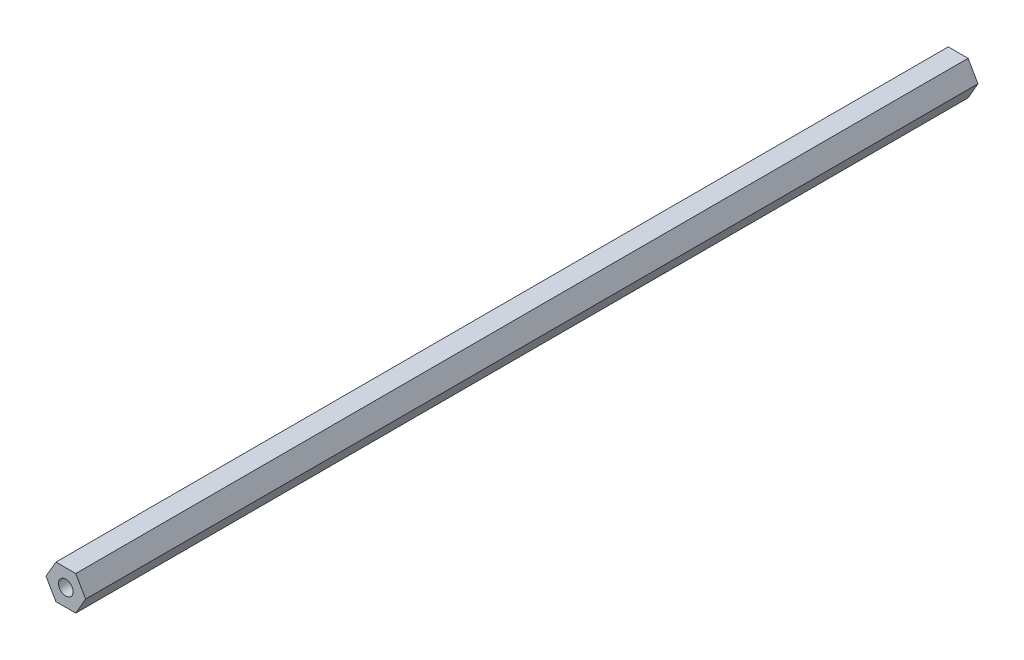
ISO-10303-21;
HEADER;
FILE_DESCRIPTION(('STEP AP214'),'2;1');
FILE_NAME('part.step','',(''),(''),'','','');
FILE_SCHEMA(('AUTOMOTIVE_DESIGN { 1 0 10303 214 1 1 1 1 }'));
ENDSEC;
DATA;
#1=APPLICATION_CONTEXT('core data for automotive mechanical design processes');
#2=APPLICATION_PROTOCOL_DEFINITION('international standard','automotive_design',2000,#1);
#3=PRODUCT_CONTEXT('',#1,'mechanical');
#4=PRODUCT('Part','Part','',(#3));
#5=PRODUCT_RELATED_PRODUCT_CATEGORY('part','',(#4));
#6=PRODUCT_DEFINITION_FORMATION('','',#4);
#7=PRODUCT_DEFINITION_CONTEXT('part definition',#1,'design');
#8=PRODUCT_DEFINITION('design','',#6,#7);
#9=PRODUCT_DEFINITION_SHAPE('','',#8);
#10=(LENGTH_UNIT() NAMED_UNIT(*) SI_UNIT(.MILLI.,.METRE.));
#11=(NAMED_UNIT(*) PLANE_ANGLE_UNIT() SI_UNIT($,.RADIAN.));
#12=(NAMED_UNIT(*) SI_UNIT($,.STERADIAN.) SOLID_ANGLE_UNIT());
#13=UNCERTAINTY_MEASURE_WITH_UNIT(LENGTH_MEASURE(1.E-05),#10,'distance_accuracy_value','');
#14=(GEOMETRIC_REPRESENTATION_CONTEXT(3) GLOBAL_UNCERTAINTY_ASSIGNED_CONTEXT((#13)) GLOBAL_UNIT_ASSIGNED_CONTEXT((#10,
#11,#12)) REPRESENTATION_CONTEXT('',''));
#15=CARTESIAN_POINT('',(0.,0.,0.));
#16=DIRECTION('',(0.,0.,1.));
#17=DIRECTION('',(1.,0.,0.));
#18=AXIS2_PLACEMENT_3D('',#15,#16,#17);
#19=CARTESIAN_POINT('',(3.66617420935412,-6.35,165.1));
#20=DIRECTION('',(-0.866025403784439,0.5,0.));
#21=DIRECTION('',(-0.5,-0.866025403784439,0.));
#22=AXIS2_PLACEMENT_3D('',#19,#20,#21);
#23=PLANE('',#22);
#24=DIRECTION('',(0.5,0.866025403784439,0.));
#25=VECTOR('',#24,1.);
#26=CARTESIAN_POINT('',(3.66617420935412,-6.35,-165.1));
#27=LINE('',#26,#25);
#28=CARTESIAN_POINT('',(3.66617420935412,-6.35,-165.1));
#29=VERTEX_POINT('',#28);
#30=CARTESIAN_POINT('',(7.33234841870824,0.,-165.1));
#31=VERTEX_POINT('',#30);
#32=EDGE_CURVE('E122',#29,#31,#27,.T.);
#33=ORIENTED_EDGE('',*,*,#32,.T.);
#34=DIRECTION('',(0.,0.,-1.));
#35=VECTOR('',#34,1.);
#36=CARTESIAN_POINT('',(7.33234841870824,0.,165.1));
#37=LINE('',#36,#35);
#38=CARTESIAN_POINT('',(7.33234841870824,0.,165.1));
#39=VERTEX_POINT('',#38);
#40=EDGE_CURVE('E11',#39,#31,#37,.T.);
#41=ORIENTED_EDGE('',*,*,#40,.F.);
#42=DIRECTION('',(0.5,0.866025403784439,0.));
#43=VECTOR('',#42,1.);
#44=CARTESIAN_POINT('',(3.66617420935412,-6.35,165.1));
#45=LINE('',#44,#43);
#46=CARTESIAN_POINT('',(3.66617420935412,-6.35,165.1));
#47=VERTEX_POINT('',#46);
#48=EDGE_CURVE('E133',#47,#39,#45,.T.);
#49=ORIENTED_EDGE('',*,*,#48,.F.);
#50=DIRECTION('',(0.,0.,-1.));
#51=VECTOR('',#50,1.);
#52=CARTESIAN_POINT('',(3.66617420935412,-6.35,165.1));
#53=LINE('',#52,#51);
#54=EDGE_CURVE('E118',#47,#29,#53,.T.);
#55=ORIENTED_EDGE('',*,*,#54,.T.);
#56=EDGE_LOOP('',(#33,#41,#49,#55));
#57=FACE_BOUND('',#56,.T.);
#58=ADVANCED_FACE('F35',(#57),#23,.F.);
#59=CARTESIAN_POINT('',(7.33234841870824,0.,165.1));
#60=DIRECTION('',(-0.866025403784438,-0.5,0.));
#61=DIRECTION('',(0.5,-0.866025403784439,0.));
#62=AXIS2_PLACEMENT_3D('',#59,#60,#61);
#63=PLANE('',#62);
#64=DIRECTION('',(-0.5,0.866025403784439,0.));
#65=VECTOR('',#64,1.);
#66=CARTESIAN_POINT('',(7.33234841870824,0.,-165.1));
#67=LINE('',#66,#65);
#68=CARTESIAN_POINT('',(3.66617420935412,6.35000000000001,-165.1));
#69=VERTEX_POINT('',#68);
#70=EDGE_CURVE('E125',#31,#69,#67,.T.);
#71=ORIENTED_EDGE('',*,*,#70,.T.);
#72=DIRECTION('',(0.,0.,-1.));
#73=VECTOR('',#72,1.);
#74=CARTESIAN_POINT('',(3.66617420935412,6.35000000000001,165.1));
#75=LINE('',#74,#73);
#76=CARTESIAN_POINT('',(3.66617420935412,6.35000000000001,165.1));
#77=VERTEX_POINT('',#76);
#78=EDGE_CURVE('E43',#77,#69,#75,.T.);
#79=ORIENTED_EDGE('',*,*,#78,.F.);
#80=DIRECTION('',(-0.5,0.866025403784439,0.));
#81=VECTOR('',#80,1.);
#82=CARTESIAN_POINT('',(7.33234841870824,0.,165.1));
#83=LINE('',#82,#81);
#84=EDGE_CURVE('E89',#39,#77,#83,.T.);
#85=ORIENTED_EDGE('',*,*,#84,.F.);
#86=ORIENTED_EDGE('',*,*,#40,.T.);
#87=EDGE_LOOP('',(#71,#79,#85,#86));
#88=FACE_BOUND('',#87,.T.);
#89=ADVANCED_FACE('F158',(#88),#63,.F.);
#90=CARTESIAN_POINT('',(3.66617420935412,6.35000000000001,165.1));
#91=DIRECTION('',(0.,-1.,0.));
#92=DIRECTION('',(0.,0.,-1.));
#93=AXIS2_PLACEMENT_3D('',#90,#91,#92);
#94=PLANE('',#93);
#95=DIRECTION('',(-1.,0.,0.));
#96=VECTOR('',#95,1.);
#97=CARTESIAN_POINT('',(3.66617420935412,6.35000000000001,-165.1));
#98=LINE('',#97,#96);
#99=CARTESIAN_POINT('',(-3.66617420935412,6.35000000000001,-165.1));
#100=VERTEX_POINT('',#99);
#101=EDGE_CURVE('E128',#69,#100,#98,.T.);
#102=ORIENTED_EDGE('',*,*,#101,.T.);
#103=DIRECTION('',(0.,0.,-1.));
#104=VECTOR('',#103,1.);
#105=CARTESIAN_POINT('',(-3.66617420935412,6.35000000000001,165.1));
#106=LINE('',#105,#104);
#107=CARTESIAN_POINT('',(-3.66617420935412,6.35000000000001,165.1));
#108=VERTEX_POINT('',#107);
#109=EDGE_CURVE('E113',#108,#100,#106,.T.);
#110=ORIENTED_EDGE('',*,*,#109,.F.);
#111=DIRECTION('',(-1.,0.,0.));
#112=VECTOR('',#111,1.);
#113=CARTESIAN_POINT('',(3.66617420935412,6.35000000000001,165.1));
#114=LINE('',#113,#112);
#115=EDGE_CURVE('E104',#77,#108,#114,.T.);
#116=ORIENTED_EDGE('',*,*,#115,.F.);
#117=ORIENTED_EDGE('',*,*,#78,.T.);
#118=EDGE_LOOP('',(#102,#110,#116,#117));
#119=FACE_BOUND('',#118,.T.);
#120=ADVANCED_FACE('F139',(#119),#94,.F.);
#121=CARTESIAN_POINT('',(-3.66617420935412,6.35000000000001,165.1));
#122=DIRECTION('',(0.866025403784438,-0.5,0.));
#123=DIRECTION('',(0.5,0.866025403784439,0.));
#124=AXIS2_PLACEMENT_3D('',#121,#122,#123);
#125=PLANE('',#124);
#126=DIRECTION('',(-0.5,-0.866025403784439,0.));
#127=VECTOR('',#126,1.);
#128=CARTESIAN_POINT('',(-3.66617420935412,6.35000000000001,-165.1));
#129=LINE('',#128,#127);
#130=CARTESIAN_POINT('',(-7.33234841870825,0.,-165.1));
#131=VERTEX_POINT('',#130);
#132=EDGE_CURVE('E112',#100,#131,#129,.T.);
#133=ORIENTED_EDGE('',*,*,#132,.T.);
#134=DIRECTION('',(0.,0.,-1.));
#135=VECTOR('',#134,1.);
#136=CARTESIAN_POINT('',(-7.33234841870825,0.,165.1));
#137=LINE('',#136,#135);
#138=CARTESIAN_POINT('',(-7.33234841870825,0.,165.1));
#139=VERTEX_POINT('',#138);
#140=EDGE_CURVE('E109',#139,#131,#137,.T.);
#141=ORIENTED_EDGE('',*,*,#140,.F.);
#142=DIRECTION('',(-0.5,-0.866025403784439,0.));
#143=VECTOR('',#142,1.);
#144=CARTESIAN_POINT('',(-3.66617420935412,6.35000000000001,165.1));
#145=LINE('',#144,#143);
#146=EDGE_CURVE('E98',#108,#139,#145,.T.);
#147=ORIENTED_EDGE('',*,*,#146,.F.);
#148=ORIENTED_EDGE('',*,*,#109,.T.);
#149=EDGE_LOOP('',(#133,#141,#147,#148));
#150=FACE_BOUND('',#149,.T.);
#151=ADVANCED_FACE('F110',(#150),#125,.F.);
#152=CARTESIAN_POINT('',(-7.33234841870825,0.,165.1));
#153=DIRECTION('',(0.866025403784439,0.5,0.));
#154=DIRECTION('',(-0.5,0.866025403784439,0.));
#155=AXIS2_PLACEMENT_3D('',#152,#153,#154);
#156=PLANE('',#155);
#157=DIRECTION('',(0.5,-0.866025403784439,0.));
#158=VECTOR('',#157,1.);
#159=CARTESIAN_POINT('',(-7.33234841870825,0.,-165.1));
#160=LINE('',#159,#158);
#161=CARTESIAN_POINT('',(-3.66617420935413,-6.35,-165.1));
#162=VERTEX_POINT('',#161);
#163=EDGE_CURVE('E75',#131,#162,#160,.T.);
#164=ORIENTED_EDGE('',*,*,#163,.T.);
#165=DIRECTION('',(0.,0.,-1.));
#166=VECTOR('',#165,1.);
#167=CARTESIAN_POINT('',(-3.66617420935413,-6.35,165.1));
#168=LINE('',#167,#166);
#169=CARTESIAN_POINT('',(-3.66617420935413,-6.35,165.1));
#170=VERTEX_POINT('',#169);
#171=EDGE_CURVE('E114',#170,#162,#168,.T.);
#172=ORIENTED_EDGE('',*,*,#171,.F.);
#173=DIRECTION('',(0.5,-0.866025403784439,0.));
#174=VECTOR('',#173,1.);
#175=CARTESIAN_POINT('',(-7.33234841870825,0.,165.1));
#176=LINE('',#175,#174);
#177=EDGE_CURVE('E102',#139,#170,#176,.T.);
#178=ORIENTED_EDGE('',*,*,#177,.F.);
#179=ORIENTED_EDGE('',*,*,#140,.T.);
#180=EDGE_LOOP('',(#164,#172,#178,#179));
#181=FACE_BOUND('',#180,.T.);
#182=ADVANCED_FACE('F116',(#181),#156,.F.);
#183=CARTESIAN_POINT('',(-3.66617420935413,-6.35,165.1));
#184=DIRECTION('',(0.,1.,0.));
#185=DIRECTION('',(-1.,0.,0.));
#186=AXIS2_PLACEMENT_3D('',#183,#184,#185);
#187=PLANE('',#186);
#188=DIRECTION('',(1.,0.,0.));
#189=VECTOR('',#188,1.);
#190=CARTESIAN_POINT('',(-3.66617420935413,-6.35,-165.1));
#191=LINE('',#190,#189);
#192=EDGE_CURVE('E81',#162,#29,#191,.T.);
#193=ORIENTED_EDGE('',*,*,#192,.T.);
#194=ORIENTED_EDGE('',*,*,#54,.F.);
#195=DIRECTION('',(1.,0.,0.));
#196=VECTOR('',#195,1.);
#197=CARTESIAN_POINT('',(-3.66617420935413,-6.35,165.1));
#198=LINE('',#197,#196);
#199=EDGE_CURVE('E51',#170,#47,#198,.T.);
#200=ORIENTED_EDGE('',*,*,#199,.F.);
#201=ORIENTED_EDGE('',*,*,#171,.T.);
#202=EDGE_LOOP('',(#193,#194,#200,#201));
#203=FACE_BOUND('',#202,.T.);
#204=ADVANCED_FACE('F146',(#203),#187,.F.);
#205=CARTESIAN_POINT('',(0.,0.,165.1));
#206=DIRECTION('',(0.,0.,1.));
#207=DIRECTION('',(1.,0.,0.));
#208=AXIS2_PLACEMENT_3D('',#205,#206,#207);
#209=PLANE('',#208);
#210=CARTESIAN_POINT('',(0.,0.,165.1));
#211=DIRECTION('',(0.,0.,1.));
#212=DIRECTION('',(1.,0.,0.));
#213=AXIS2_PLACEMENT_3D('',#210,#211,#212);
#214=CIRCLE('',#213,2.7051);
#215=CARTESIAN_POINT('',(2.7051,0.,165.1));
#216=VERTEX_POINT('',#215);
#217=EDGE_CURVE('E244',#216,#216,#214,.T.);
#218=ORIENTED_EDGE('',*,*,#217,.F.);
#219=EDGE_LOOP('',(#218));
#220=FACE_BOUND('',#219,.T.);
#221=ORIENTED_EDGE('',*,*,#48,.T.);
#222=ORIENTED_EDGE('',*,*,#84,.T.);
#223=ORIENTED_EDGE('',*,*,#115,.T.);
#224=ORIENTED_EDGE('',*,*,#146,.T.);
#225=ORIENTED_EDGE('',*,*,#177,.T.);
#226=ORIENTED_EDGE('',*,*,#199,.T.);
#227=EDGE_LOOP('',(#221,#222,#223,#224,#225,#226));
#228=FACE_BOUND('',#227,.T.);
#229=ADVANCED_FACE('F100',(#220,#228),#209,.T.);
#230=CARTESIAN_POINT('',(0.,0.,-165.1));
#231=DIRECTION('',(0.,0.,1.));
#232=DIRECTION('',(1.,0.,0.));
#233=AXIS2_PLACEMENT_3D('',#230,#231,#232);
#234=PLANE('',#233);
#235=CARTESIAN_POINT('',(0.,0.,-165.1));
#236=DIRECTION('',(0.,0.,-1.));
#237=DIRECTION('',(-1.,0.,0.));
#238=AXIS2_PLACEMENT_3D('',#235,#236,#237);
#239=CIRCLE('',#238,2.7051);
#240=CARTESIAN_POINT('',(-2.7051,0.,-165.1));
#241=VERTEX_POINT('',#240);
#242=EDGE_CURVE('E246',#241,#241,#239,.T.);
#243=ORIENTED_EDGE('',*,*,#242,.F.);
#244=EDGE_LOOP('',(#243));
#245=FACE_BOUND('',#244,.T.);
#246=ORIENTED_EDGE('',*,*,#32,.F.);
#247=ORIENTED_EDGE('',*,*,#192,.F.);
#248=ORIENTED_EDGE('',*,*,#163,.F.);
#249=ORIENTED_EDGE('',*,*,#132,.F.);
#250=ORIENTED_EDGE('',*,*,#101,.F.);
#251=ORIENTED_EDGE('',*,*,#70,.F.);
#252=EDGE_LOOP('',(#246,#247,#248,#249,#250,#251));
#253=FACE_BOUND('',#252,.T.);
#254=ADVANCED_FACE('F142',(#245,#253),#234,.F.);
#255=CARTESIAN_POINT('',(0.,0.,-136.906));
#256=DIRECTION('',(0.,0.,-1.));
#257=DIRECTION('',(-1.,0.,0.));
#258=AXIS2_PLACEMENT_3D('',#255,#256,#257);
#259=CONICAL_SURFACE('',#258,2.70509999999999,1.02974425867665);
#260=CARTESIAN_POINT('',(0.,0.,-135.280611939469));
#261=VERTEX_POINT('',#260);
#262=VERTEX_LOOP('',#261);
#263=FACE_BOUND('',#262,.T.);
#264=CARTESIAN_POINT('',(0.,0.,-136.906));
#265=DIRECTION('',(0.,0.,-1.));
#266=DIRECTION('',(-1.,0.,0.));
#267=AXIS2_PLACEMENT_3D('',#264,#265,#266);
#268=CIRCLE('',#267,2.70509999999999);
#269=CARTESIAN_POINT('',(-2.70509999999999,0.,-136.906));
#270=VERTEX_POINT('',#269);
#271=EDGE_CURVE('E126',#270,#270,#268,.T.);
#272=ORIENTED_EDGE('',*,*,#271,.T.);
#273=EDGE_LOOP('',(#272));
#274=FACE_BOUND('',#273,.T.);
#275=ADVANCED_FACE('F195',(#263,#274),#259,.F.);
#276=CARTESIAN_POINT('',(0.,0.,-165.1));
#277=DIRECTION('',(0.,0.,-1.));
#278=DIRECTION('',(-1.,0.,0.));
#279=AXIS2_PLACEMENT_3D('',#276,#277,#278);
#280=CYLINDRICAL_SURFACE('',#279,2.70509999999999);
#281=ORIENTED_EDGE('',*,*,#271,.F.);
#282=EDGE_LOOP('',(#281));
#283=FACE_BOUND('',#282,.T.);
#284=ORIENTED_EDGE('',*,*,#242,.T.);
#285=EDGE_LOOP('',(#284));
#286=FACE_BOUND('',#285,.T.);
#287=ADVANCED_FACE('F204',(#283,#286),#280,.F.);
#288=CARTESIAN_POINT('',(0.,0.,136.906));
#289=DIRECTION('',(0.,0.,1.));
#290=DIRECTION('',(1.,0.,0.));
#291=AXIS2_PLACEMENT_3D('',#288,#289,#290);
#292=CONICAL_SURFACE('',#291,2.70509999999999,1.02974425867665);
#293=CARTESIAN_POINT('',(0.,0.,135.280611939469));
#294=VERTEX_POINT('',#293);
#295=VERTEX_LOOP('',#294);
#296=FACE_BOUND('',#295,.T.);
#297=CARTESIAN_POINT('',(0.,0.,136.906));
#298=DIRECTION('',(0.,0.,1.));
#299=DIRECTION('',(1.,0.,0.));
#300=AXIS2_PLACEMENT_3D('',#297,#298,#299);
#301=CIRCLE('',#300,2.70509999999999);
#302=CARTESIAN_POINT('',(2.70509999999999,0.,136.906));
#303=VERTEX_POINT('',#302);
#304=EDGE_CURVE('E241',#303,#303,#301,.T.);
#305=ORIENTED_EDGE('',*,*,#304,.T.);
#306=EDGE_LOOP('',(#305));
#307=FACE_BOUND('',#306,.T.);
#308=ADVANCED_FACE('F214',(#296,#307),#292,.F.);
#309=CARTESIAN_POINT('',(0.,0.,165.1));
#310=DIRECTION('',(0.,0.,1.));
#311=DIRECTION('',(1.,0.,0.));
#312=AXIS2_PLACEMENT_3D('',#309,#310,#311);
#313=CYLINDRICAL_SURFACE('',#312,2.70509999999999);
#314=ORIENTED_EDGE('',*,*,#304,.F.);
#315=EDGE_LOOP('',(#314));
#316=FACE_BOUND('',#315,.T.);
#317=ORIENTED_EDGE('',*,*,#217,.T.);
#318=EDGE_LOOP('',(#317));
#319=FACE_BOUND('',#318,.T.);
#320=ADVANCED_FACE('F224',(#316,#319),#313,.F.);
#321=CLOSED_SHELL('',(#58,#89,#120,#151,#182,#204,#229,#254,#275,#287,#308,#320));
#322=MANIFOLD_SOLID_BREP('B2',#321);
#323=ADVANCED_BREP_SHAPE_REPRESENTATION('',(#18,#322),#14);
#324=SHAPE_DEFINITION_REPRESENTATION(#9,#323);
ENDSEC;
END-ISO-10303-21;
